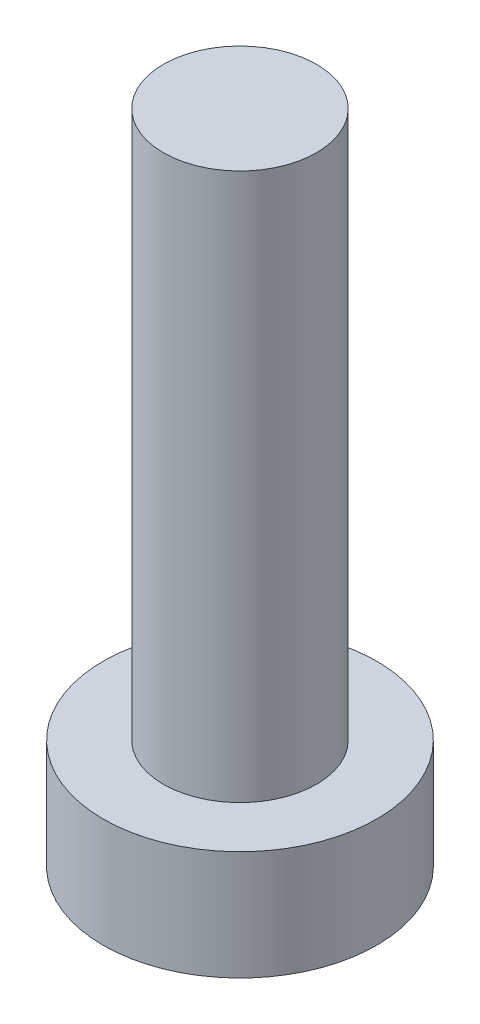
ISO-10303-21;
HEADER;
FILE_DESCRIPTION(('STEP AP214'),'2;1');
FILE_NAME('part.step','',(''),(''),'','','');
FILE_SCHEMA(('AUTOMOTIVE_DESIGN { 1 0 10303 214 1 1 1 1 }'));
ENDSEC;
DATA;
#1=APPLICATION_CONTEXT('core data for automotive mechanical design processes');
#2=APPLICATION_PROTOCOL_DEFINITION('international standard','automotive_design',2000,#1);
#3=PRODUCT_CONTEXT('',#1,'mechanical');
#4=PRODUCT('Part','Part','',(#3));
#5=PRODUCT_RELATED_PRODUCT_CATEGORY('part','',(#4));
#6=PRODUCT_DEFINITION_FORMATION('','',#4);
#7=PRODUCT_DEFINITION_CONTEXT('part definition',#1,'design');
#8=PRODUCT_DEFINITION('design','',#6,#7);
#9=PRODUCT_DEFINITION_SHAPE('','',#8);
#10=(LENGTH_UNIT() NAMED_UNIT(*) SI_UNIT(.MILLI.,.METRE.));
#11=(NAMED_UNIT(*) PLANE_ANGLE_UNIT() SI_UNIT($,.RADIAN.));
#12=(NAMED_UNIT(*) SI_UNIT($,.STERADIAN.) SOLID_ANGLE_UNIT());
#13=UNCERTAINTY_MEASURE_WITH_UNIT(LENGTH_MEASURE(1.E-05),#10,'distance_accuracy_value','');
#14=(GEOMETRIC_REPRESENTATION_CONTEXT(3) GLOBAL_UNCERTAINTY_ASSIGNED_CONTEXT((#13)) GLOBAL_UNIT_ASSIGNED_CONTEXT((#10,
#11,#12)) REPRESENTATION_CONTEXT('',''));
#15=CARTESIAN_POINT('',(0.,0.,0.));
#16=DIRECTION('',(0.,0.,1.));
#17=DIRECTION('',(1.,0.,0.));
#18=AXIS2_PLACEMENT_3D('',#15,#16,#17);
#19=CARTESIAN_POINT('',(0.,58.709677419355,0.));
#20=DIRECTION('',(0.,-1.,0.));
#21=DIRECTION('',(0.,0.,-1.));
#22=AXIS2_PLACEMENT_3D('',#19,#20,#21);
#23=PLANE('',#22);
#24=CARTESIAN_POINT('',(0.,58.709677419355,0.));
#25=DIRECTION('',(0.,1.,0.));
#26=DIRECTION('',(0.,0.,1.));
#27=AXIS2_PLACEMENT_3D('',#24,#25,#26);
#28=CIRCLE('',#27,7.);
#29=CARTESIAN_POINT('',(0.,58.709677419355,7.));
#30=VERTEX_POINT('',#29);
#31=EDGE_CURVE('E10',#30,#30,#28,.T.);
#32=ORIENTED_EDGE('',*,*,#31,.T.);
#33=EDGE_LOOP('',(#32));
#34=FACE_BOUND('',#33,.T.);
#35=ADVANCED_FACE('F31',(#34),#23,.F.);
#36=CARTESIAN_POINT('',(0.,94.8387096774196,0.));
#37=DIRECTION('',(0.,1.,0.));
#38=DIRECTION('',(0.,0.,1.));
#39=AXIS2_PLACEMENT_3D('',#36,#37,#38);
#40=CYLINDRICAL_SURFACE('',#39,7.00000000000001);
#41=ORIENTED_EDGE('',*,*,#31,.F.);
#42=EDGE_LOOP('',(#41));
#43=FACE_BOUND('',#42,.T.);
#44=CARTESIAN_POINT('',(0.,8.70967741935495,0.));
#45=DIRECTION('',(0.,1.,0.));
#46=DIRECTION('',(0.,0.,1.));
#47=AXIS2_PLACEMENT_3D('',#44,#45,#46);
#48=CIRCLE('',#47,7.00000000000001);
#49=CARTESIAN_POINT('',(0.,8.70967741935495,7.00000000000001));
#50=VERTEX_POINT('',#49);
#51=EDGE_CURVE('E37',#50,#50,#48,.T.);
#52=ORIENTED_EDGE('',*,*,#51,.T.);
#53=EDGE_LOOP('',(#52));
#54=FACE_BOUND('',#53,.T.);
#55=ADVANCED_FACE('F63',(#43,#54),#40,.T.);
#56=CARTESIAN_POINT('',(0.,8.70967741935495,-7.00000000000001));
#57=DIRECTION('',(0.,-1.,0.));
#58=DIRECTION('',(0.,0.,-1.));
#59=AXIS2_PLACEMENT_3D('',#56,#57,#58);
#60=PLANE('',#59);
#61=ORIENTED_EDGE('',*,*,#51,.F.);
#62=EDGE_LOOP('',(#61));
#63=FACE_BOUND('',#62,.T.);
#64=CARTESIAN_POINT('',(0.,8.70967741935495,0.));
#65=DIRECTION('',(0.,1.,0.));
#66=DIRECTION('',(0.,0.,1.));
#67=AXIS2_PLACEMENT_3D('',#64,#65,#66);
#68=CIRCLE('',#67,12.5);
#69=CARTESIAN_POINT('',(0.,8.70967741935495,12.5));
#70=VERTEX_POINT('',#69);
#71=EDGE_CURVE('E41',#70,#70,#68,.T.);
#72=ORIENTED_EDGE('',*,*,#71,.T.);
#73=EDGE_LOOP('',(#72));
#74=FACE_BOUND('',#73,.T.);
#75=ADVANCED_FACE('F59',(#63,#74),#60,.F.);
#76=CARTESIAN_POINT('',(0.,94.8387096774196,0.));
#77=DIRECTION('',(0.,1.,0.));
#78=DIRECTION('',(0.,0.,1.));
#79=AXIS2_PLACEMENT_3D('',#76,#77,#78);
#80=CYLINDRICAL_SURFACE('',#79,12.5);
#81=ORIENTED_EDGE('',*,*,#71,.F.);
#82=EDGE_LOOP('',(#81));
#83=FACE_BOUND('',#82,.T.);
#84=CARTESIAN_POINT('',(0.,-1.29032258064504,0.));
#85=DIRECTION('',(0.,1.,0.));
#86=DIRECTION('',(0.,0.,1.));
#87=AXIS2_PLACEMENT_3D('',#84,#85,#86);
#88=CIRCLE('',#87,12.5);
#89=CARTESIAN_POINT('',(0.,-1.29032258064504,12.5));
#90=VERTEX_POINT('',#89);
#91=EDGE_CURVE('E45',#90,#90,#88,.T.);
#92=ORIENTED_EDGE('',*,*,#91,.T.);
#93=EDGE_LOOP('',(#92));
#94=FACE_BOUND('',#93,.T.);
#95=ADVANCED_FACE('F51',(#83,#94),#80,.T.);
#96=CARTESIAN_POINT('',(0.,-1.29032258064505,-12.5));
#97=DIRECTION('',(0.,1.,0.));
#98=DIRECTION('',(0.,0.,1.));
#99=AXIS2_PLACEMENT_3D('',#96,#97,#98);
#100=PLANE('',#99);
#101=ORIENTED_EDGE('',*,*,#91,.F.);
#102=EDGE_LOOP('',(#101));
#103=FACE_BOUND('',#102,.T.);
#104=ADVANCED_FACE('F53',(#103),#100,.F.);
#105=CLOSED_SHELL('',(#35,#55,#75,#95,#104));
#106=MANIFOLD_SOLID_BREP('B2',#105);
#107=ADVANCED_BREP_SHAPE_REPRESENTATION('',(#18,#106),#14);
#108=SHAPE_DEFINITION_REPRESENTATION(#9,#107);
ENDSEC;
END-ISO-10303-21;
